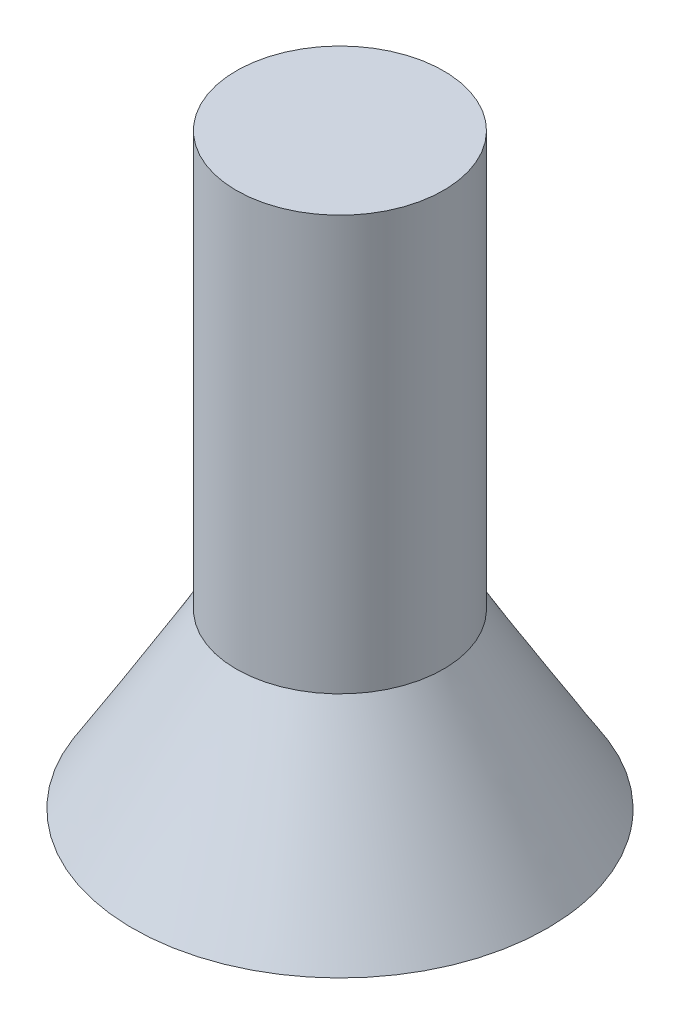
ISO-10303-21;
HEADER;
FILE_DESCRIPTION(('STEP AP214'),'2;1');
FILE_NAME('part.step','',(''),(''),'','','');
FILE_SCHEMA(('AUTOMOTIVE_DESIGN { 1 0 10303 214 1 1 1 1 }'));
ENDSEC;
DATA;
#1=APPLICATION_CONTEXT('core data for automotive mechanical design processes');
#2=APPLICATION_PROTOCOL_DEFINITION('international standard','automotive_design',2000,#1);
#3=PRODUCT_CONTEXT('',#1,'mechanical');
#4=PRODUCT('Part','Part','',(#3));
#5=PRODUCT_RELATED_PRODUCT_CATEGORY('part','',(#4));
#6=PRODUCT_DEFINITION_FORMATION('','',#4);
#7=PRODUCT_DEFINITION_CONTEXT('part definition',#1,'design');
#8=PRODUCT_DEFINITION('design','',#6,#7);
#9=PRODUCT_DEFINITION_SHAPE('','',#8);
#10=(LENGTH_UNIT() NAMED_UNIT(*) SI_UNIT(.MILLI.,.METRE.));
#11=(NAMED_UNIT(*) PLANE_ANGLE_UNIT() SI_UNIT($,.RADIAN.));
#12=(NAMED_UNIT(*) SI_UNIT($,.STERADIAN.) SOLID_ANGLE_UNIT());
#13=UNCERTAINTY_MEASURE_WITH_UNIT(LENGTH_MEASURE(1.E-05),#10,'distance_accuracy_value','');
#14=(GEOMETRIC_REPRESENTATION_CONTEXT(3) GLOBAL_UNCERTAINTY_ASSIGNED_CONTEXT((#13)) GLOBAL_UNIT_ASSIGNED_CONTEXT((#10,
#11,#12)) REPRESENTATION_CONTEXT('',''));
#15=CARTESIAN_POINT('',(0.,0.,0.));
#16=DIRECTION('',(0.,0.,1.));
#17=DIRECTION('',(1.,0.,0.));
#18=AXIS2_PLACEMENT_3D('',#15,#16,#17);
#19=CARTESIAN_POINT('',(0.,0.,0.));
#20=DIRECTION('',(0.,1.,0.));
#21=DIRECTION('',(0.,0.,1.));
#22=AXIS2_PLACEMENT_3D('',#19,#20,#21);
#23=PLANE('',#22);
#24=DIRECTION('',(-1.,0.,0.));
#25=VECTOR('',#24,1.);
#26=CARTESIAN_POINT('',(0.577350269189625,0.,1.));
#27=LINE('',#26,#25);
#28=CARTESIAN_POINT('',(0.577350269189625,0.,1.));
#29=VERTEX_POINT('',#28);
#30=CARTESIAN_POINT('',(-0.577350269189626,0.,1.));
#31=VERTEX_POINT('',#30);
#32=EDGE_CURVE('E138',#29,#31,#27,.T.);
#33=ORIENTED_EDGE('',*,*,#32,.F.);
#34=DIRECTION('',(-0.5,0.,0.866025403784439));
#35=VECTOR('',#34,1.);
#36=CARTESIAN_POINT('',(1.15470053837925,0.,0.));
#37=LINE('',#36,#35);
#38=CARTESIAN_POINT('',(1.15470053837925,0.,0.));
#39=VERTEX_POINT('',#38);
#40=EDGE_CURVE('E64',#39,#29,#37,.T.);
#41=ORIENTED_EDGE('',*,*,#40,.F.);
#42=DIRECTION('',(0.5,0.,0.866025403784439));
#43=VECTOR('',#42,1.);
#44=CARTESIAN_POINT('',(0.577350269189626,0.,-0.999999999999999));
#45=LINE('',#44,#43);
#46=CARTESIAN_POINT('',(0.577350269189626,0.,-0.999999999999999));
#47=VERTEX_POINT('',#46);
#48=EDGE_CURVE('E147',#47,#39,#45,.T.);
#49=ORIENTED_EDGE('',*,*,#48,.F.);
#50=DIRECTION('',(1.,0.,0.));
#51=VECTOR('',#50,1.);
#52=CARTESIAN_POINT('',(-0.577350269189625,0.,-0.999999999999999));
#53=LINE('',#52,#51);
#54=CARTESIAN_POINT('',(-0.577350269189625,0.,-0.999999999999999));
#55=VERTEX_POINT('',#54);
#56=EDGE_CURVE('E145',#55,#47,#53,.T.);
#57=ORIENTED_EDGE('',*,*,#56,.F.);
#58=DIRECTION('',(0.5,0.,-0.866025403784438));
#59=VECTOR('',#58,1.);
#60=CARTESIAN_POINT('',(-1.15470053837925,0.,0.));
#61=LINE('',#60,#59);
#62=CARTESIAN_POINT('',(-1.15470053837925,0.,0.));
#63=VERTEX_POINT('',#62);
#64=EDGE_CURVE('E112',#63,#55,#61,.T.);
#65=ORIENTED_EDGE('',*,*,#64,.F.);
#66=DIRECTION('',(-0.5,0.,-0.866025403784439));
#67=VECTOR('',#66,1.);
#68=CARTESIAN_POINT('',(-0.577350269189626,0.,1.));
#69=LINE('',#68,#67);
#70=EDGE_CURVE('E141',#31,#63,#69,.T.);
#71=ORIENTED_EDGE('',*,*,#70,.F.);
#72=EDGE_LOOP('',(#33,#41,#49,#57,#65,#71));
#73=FACE_BOUND('',#72,.T.);
#74=CARTESIAN_POINT('',(0.,0.,0.));
#75=DIRECTION('',(0.,1.,0.));
#76=DIRECTION('',(0.,0.,1.));
#77=AXIS2_PLACEMENT_3D('',#74,#75,#76);
#78=CIRCLE('',#77,3.);
#79=CARTESIAN_POINT('',(-2.6965657370898,0.,1.31473694157932));
#80=VERTEX_POINT('',#79);
#81=EDGE_CURVE('E57',#80,#80,#78,.T.);
#82=ORIENTED_EDGE('',*,*,#81,.F.);
#83=EDGE_LOOP('',(#82));
#84=FACE_BOUND('',#83,.T.);
#85=ADVANCED_FACE('F45',(#73,#84),#23,.F.);
#86=CARTESIAN_POINT('',(-2.6965657370898,0.,1.31473694157932));
#87=CARTESIAN_POINT('',(-1.46387514290812,2.5,0.327214862094814));
#88=CARTESIAN_POINT('',(-0.0670918539311506,0.,6.70786841575892));
#89=CARTESIAN_POINT('',(-0.809445418718492,2.5,3.25496514791106));
#90=CARTESIAN_POINT('',(5.32603962024845,0.,4.07839453260027));
#91=CARTESIAN_POINT('',(2.11830486709775,2.5,2.60053542372143));
#92=CARTESIAN_POINT('',(2.6965657370898,0.,-1.31473694157932));
#93=CARTESIAN_POINT('',(1.46387514290812,2.5,-0.327214862094814));
#94=CARTESIAN_POINT('',(0.0670918539311498,0.,-6.70786841575892));
#95=CARTESIAN_POINT('',(0.809445418718492,2.5,-3.25496514791106));
#96=CARTESIAN_POINT('',(-5.32603962024845,0.,-4.07839453260027));
#97=CARTESIAN_POINT('',(-2.11830486709775,2.5,-2.60053542372143));
#98=CARTESIAN_POINT('',(-2.6965657370898,0.,1.31473694157932));
#99=CARTESIAN_POINT('',(-1.46387514290812,2.5,0.327214862094814));
#100=(BOUNDED_SURFACE() B_SPLINE_SURFACE(3,1,((#86,#87),(#88,#89),(#90,#91),(#92,#93),(#94,#95),
(#96,#97),(#98,#99)),.UNSPECIFIED.,.T.,.F.,.F.) B_SPLINE_SURFACE_WITH_KNOTS((4,3,4),(2,2),(0.,
0.5,1.),(0.,1.),.UNSPECIFIED.) GEOMETRIC_REPRESENTATION_ITEM() RATIONAL_B_SPLINE_SURFACE(((1.,
1.),(0.333333333333333,0.333333333333333),(0.333333333333333,0.333333333333333),(1.,1.),
(0.333333333333333,0.333333333333333),(0.333333333333333,0.333333333333333),(1.,1.))) REPRESENTATION_ITEM('') SURFACE());
#101=CARTESIAN_POINT('',(0.,2.5,0.));
#102=DIRECTION('',(0.,1.,0.));
#103=DIRECTION('',(0.,0.,1.));
#104=AXIS2_PLACEMENT_3D('',#101,#102,#103);
#105=CIRCLE('',#104,1.5);
#106=CARTESIAN_POINT('',(-1.46387514290812,2.5,0.327214862094814));
#107=VERTEX_POINT('',#106);
#108=EDGE_CURVE('E12',#107,#107,#105,.T.);
#109=CARTESIAN_POINT('',(-2.6965657370898,0.,1.31473694157932));
#110=CARTESIAN_POINT('',(-2.68372521006707,0.0260416666666666,1.30445025325136));
#111=CARTESIAN_POINT('',(-2.67088468304435,0.0520833333333333,1.2941635649234));
#112=CARTESIAN_POINT('',(-2.6452036289989,0.104166666666667,1.27359018826747));
#113=CARTESIAN_POINT('',(-2.63236310197617,0.130208333333333,1.26330349993951));
#114=CARTESIAN_POINT('',(-2.60668204793072,0.182291666666667,1.24273012328358));
#115=CARTESIAN_POINT('',(-2.59384152090799,0.208333333333333,1.23244343495561));
#116=CARTESIAN_POINT('',(-2.56816046686254,0.260416666666667,1.21187005829969));
#117=CARTESIAN_POINT('',(-2.55531993983981,0.286458333333333,1.20158336997172));
#118=CARTESIAN_POINT('',(-2.52963888579436,0.338541666666667,1.1810099933158));
#119=CARTESIAN_POINT('',(-2.51679835877164,0.364583333333333,1.17072330498783));
#120=CARTESIAN_POINT('',(-2.49111730472619,0.416666666666667,1.15014992833191));
#121=CARTESIAN_POINT('',(-2.47827677770346,0.442708333333333,1.13986324000394));
#122=CARTESIAN_POINT('',(-2.45259572365801,0.494791666666667,1.11928986334801));
#123=CARTESIAN_POINT('',(-2.43975519663528,0.520833333333333,1.10900317502005));
#124=CARTESIAN_POINT('',(-2.41407414258983,0.572916666666667,1.08842979836412));
#125=CARTESIAN_POINT('',(-2.40123361556711,0.598958333333333,1.07814311003616));
#126=CARTESIAN_POINT('',(-2.37555256152165,0.651041666666667,1.05756973338023));
#127=CARTESIAN_POINT('',(-2.36271203449893,0.677083333333333,1.04728304505227));
#128=CARTESIAN_POINT('',(-2.33703098045348,0.729166666666667,1.02670966839634));
#129=CARTESIAN_POINT('',(-2.32419045343075,0.755208333333333,1.01642298006838));
#130=CARTESIAN_POINT('',(-2.2985093993853,0.807291666666667,0.995849603412451));
#131=CARTESIAN_POINT('',(-2.28566887236257,0.833333333333333,0.985562915084487));
#132=CARTESIAN_POINT('',(-2.25998781831712,0.885416666666667,0.96498953842856));
#133=CARTESIAN_POINT('',(-2.2471472912944,0.911458333333333,0.954702850100597));
#134=CARTESIAN_POINT('',(-2.22146623724894,0.963541666666667,0.934129473444669));
#135=CARTESIAN_POINT('',(-2.20862571022622,0.989583333333333,0.923842785116706));
#136=CARTESIAN_POINT('',(-2.18294465618077,1.04166666666667,0.903269408460778));
#137=CARTESIAN_POINT('',(-2.17010412915804,1.06770833333333,0.892982720132815));
#138=CARTESIAN_POINT('',(-2.14442307511259,1.11979166666667,0.872409343476888));
#139=CARTESIAN_POINT('',(-2.13158254808986,1.14583333333333,0.862122655148924));
#140=CARTESIAN_POINT('',(-2.10590149404441,1.19791666666667,0.841549278492997));
#141=CARTESIAN_POINT('',(-2.09306096702169,1.22395833333333,0.831262590165033));
#142=CARTESIAN_POINT('',(-2.06737991297623,1.27604166666667,0.810689213509106));
#143=CARTESIAN_POINT('',(-2.05453938595351,1.30208333333333,0.800402525181142));
#144=CARTESIAN_POINT('',(-2.02885833190806,1.35416666666667,0.779829148525215));
#145=CARTESIAN_POINT('',(-2.01601780488533,1.38020833333333,0.769542460197251));
#146=CARTESIAN_POINT('',(-1.99033675083988,1.43229166666667,0.748969083541324));
#147=CARTESIAN_POINT('',(-1.97749622381715,1.45833333333333,0.73868239521336));
#148=CARTESIAN_POINT('',(-1.9518151697717,1.51041666666667,0.718109018557433));
#149=CARTESIAN_POINT('',(-1.93897464274898,1.53645833333333,0.707822330229469));
#150=CARTESIAN_POINT('',(-1.91329358870352,1.58854166666667,0.687248953573542));
#151=CARTESIAN_POINT('',(-1.9004530616808,1.61458333333333,0.676962265245578));
#152=CARTESIAN_POINT('',(-1.87477200763535,1.66666666666667,0.656388888589651));
#153=CARTESIAN_POINT('',(-1.86193148061262,1.69270833333333,0.646102200261687));
#154=CARTESIAN_POINT('',(-1.83625042656717,1.74479166666667,0.62552882360576));
#155=CARTESIAN_POINT('',(-1.82340989954444,1.77083333333333,0.615242135277796));
#156=CARTESIAN_POINT('',(-1.79772884549899,1.82291666666667,0.594668758621869));
#157=CARTESIAN_POINT('',(-1.78488831847627,1.84895833333333,0.584382070293905));
#158=CARTESIAN_POINT('',(-1.75920726443081,1.90104166666667,0.563808693637978));
#159=CARTESIAN_POINT('',(-1.74636673740809,1.92708333333333,0.553522005310014));
#160=CARTESIAN_POINT('',(-1.72068568336264,1.97916666666667,0.532948628654087));
#161=CARTESIAN_POINT('',(-1.70784515633991,2.00520833333333,0.522661940326123));
#162=CARTESIAN_POINT('',(-1.68216410229446,2.05729166666667,0.502088563670196));
#163=CARTESIAN_POINT('',(-1.66932357527173,2.08333333333333,0.491801875342233));
#164=CARTESIAN_POINT('',(-1.64364252122628,2.13541666666667,0.471228498686305));
#165=CARTESIAN_POINT('',(-1.63080199420356,2.16145833333333,0.460941810358342));
#166=CARTESIAN_POINT('',(-1.6051209401581,2.21354166666667,0.440368433702414));
#167=CARTESIAN_POINT('',(-1.59228041313538,2.23958333333333,0.430081745374451));
#168=CARTESIAN_POINT('',(-1.56659935908993,2.29166666666667,0.409508368718523));
#169=CARTESIAN_POINT('',(-1.5537588320672,2.31770833333333,0.39922168039056));
#170=CARTESIAN_POINT('',(-1.52807777802175,2.36979166666667,0.378648303734633));
#171=CARTESIAN_POINT('',(-1.51523725099902,2.39583333333333,0.368361615406669));
#172=CARTESIAN_POINT('',(-1.48955619695357,2.44791666666667,0.347788238750742));
#173=CARTESIAN_POINT('',(-1.47671566993085,2.47395833333333,0.337501550422778));
#174=CARTESIAN_POINT('',(-1.46387514290812,2.5,0.327214862094814));
#175=B_SPLINE_CURVE_WITH_KNOTS('',3,(#109,#110,#111,#112,#113,#114,#115,#116,#117,#118,#119,
#120,#121,#122,#123,#124,#125,#126,#127,#128,#129,#130,#131,#132,#133,#134,#135,#136,#137,#138,
#139,#140,#141,#142,#143,#144,#145,#146,#147,#148,#149,#150,#151,#152,#153,#154,#155,#156,#157,
#158,#159,#160,#161,#162,#163,#164,#165,#166,#167,#168,#169,#170,#171,#172,#173,#174),
.UNSPECIFIED.,.F.,.F.,(4,2,2,2,2,2,2,2,2,2,2,2,2,2,2,2,2,2,2,2,2,2,2,2,2,2,2,2,2,2,2,2,4),(0.,
0.0924108837951578,0.184821767590315,0.277232651385473,0.369643535180631,0.462054418975788,
0.554465302770946,0.646876186566104,0.739287070361262,0.831697954156419,0.924108837951577,
1.01651972174673,1.10893060554189,1.20134148933705,1.29375237313221,1.38616325692737,
1.47857414072252,1.57098502451768,1.66339590831284,1.755806792108,1.84821767590315,
1.94062855969831,2.03303944349347,2.12545032728863,2.21786121108378,2.31027209487894,
2.4026829786741,2.49509386246926,2.58750474626442,2.67991563005957,2.77232651385473,
2.86473739764989,2.95714828144505),.UNSPECIFIED.);
#176=EDGE_CURVE('BSEAM47',#80,#107,#175,.T.);
#177=ORIENTED_EDGE('',*,*,#81,.T.);
#178=ORIENTED_EDGE('',*,*,#108,.F.);
#179=ORIENTED_EDGE('',*,*,#176,.T.);
#180=ORIENTED_EDGE('',*,*,#176,.F.);
#181=EDGE_LOOP('',(#177,#179,#178,#180));
#182=FACE_BOUND('',#181,.T.);
#183=ADVANCED_FACE('F47',(#182),#100,.T.);
#184=CARTESIAN_POINT('',(0.,8.5,0.));
#185=DIRECTION('',(0.,-1.,0.));
#186=DIRECTION('',(0.,0.,-1.));
#187=AXIS2_PLACEMENT_3D('',#184,#185,#186);
#188=CYLINDRICAL_SURFACE('',#187,1.5);
#189=CARTESIAN_POINT('',(0.,8.5,0.));
#190=DIRECTION('',(0.,1.,0.));
#191=DIRECTION('',(0.,0.,1.));
#192=AXIS2_PLACEMENT_3D('',#189,#190,#191);
#193=CIRCLE('',#192,1.5);
#194=CARTESIAN_POINT('',(0.,8.5,1.5));
#195=VERTEX_POINT('',#194);
#196=EDGE_CURVE('E151',#195,#195,#193,.T.);
#197=ORIENTED_EDGE('',*,*,#196,.F.);
#198=EDGE_LOOP('',(#197));
#199=FACE_BOUND('',#198,.T.);
#200=ORIENTED_EDGE('',*,*,#108,.T.);
#201=EDGE_LOOP('',(#200));
#202=FACE_BOUND('',#201,.T.);
#203=ADVANCED_FACE('F197',(#199,#202),#188,.T.);
#204=CARTESIAN_POINT('',(0.,8.5,0.));
#205=DIRECTION('',(0.,1.,0.));
#206=DIRECTION('',(0.,0.,1.));
#207=AXIS2_PLACEMENT_3D('',#204,#205,#206);
#208=PLANE('',#207);
#209=ORIENTED_EDGE('',*,*,#196,.T.);
#210=EDGE_LOOP('',(#209));
#211=FACE_BOUND('',#210,.T.);
#212=ADVANCED_FACE('F201',(#211),#208,.T.);
#213=CARTESIAN_POINT('',(1.15470053837925,0.5,0.));
#214=DIRECTION('',(0.866025403784439,0.,0.5));
#215=DIRECTION('',(0.5,0.,-0.866025403784439));
#216=AXIS2_PLACEMENT_3D('',#213,#214,#215);
#217=PLANE('',#216);
#218=ORIENTED_EDGE('',*,*,#40,.T.);
#219=DIRECTION('',(0.,-1.,0.));
#220=VECTOR('',#219,1.);
#221=CARTESIAN_POINT('',(0.577350269189625,0.5,1.));
#222=LINE('',#221,#220);
#223=CARTESIAN_POINT('',(0.577350269189625,0.5,1.));
#224=VERTEX_POINT('',#223);
#225=EDGE_CURVE('E94',#224,#29,#222,.T.);
#226=ORIENTED_EDGE('',*,*,#225,.F.);
#227=DIRECTION('',(-0.5,0.,0.866025403784439));
#228=VECTOR('',#227,1.);
#229=CARTESIAN_POINT('',(1.15470053837925,0.5,0.));
#230=LINE('',#229,#228);
#231=CARTESIAN_POINT('',(1.15470053837925,0.5,0.));
#232=VERTEX_POINT('',#231);
#233=EDGE_CURVE('E149',#232,#224,#230,.T.);
#234=ORIENTED_EDGE('',*,*,#233,.F.);
#235=DIRECTION('',(0.,-1.,0.));
#236=VECTOR('',#235,1.);
#237=CARTESIAN_POINT('',(1.15470053837925,0.5,0.));
#238=LINE('',#237,#236);
#239=EDGE_CURVE('E72',#232,#39,#238,.T.);
#240=ORIENTED_EDGE('',*,*,#239,.T.);
#241=EDGE_LOOP('',(#218,#226,#234,#240));
#242=FACE_BOUND('',#241,.T.);
#243=ADVANCED_FACE('F216',(#242),#217,.F.);
#244=CARTESIAN_POINT('',(0.577350269189626,0.5,-0.999999999999999));
#245=DIRECTION('',(0.866025403784438,0.,-0.5));
#246=DIRECTION('',(-0.5,0.,-0.866025403784439));
#247=AXIS2_PLACEMENT_3D('',#244,#245,#246);
#248=PLANE('',#247);
#249=ORIENTED_EDGE('',*,*,#48,.T.);
#250=ORIENTED_EDGE('',*,*,#239,.F.);
#251=DIRECTION('',(0.5,0.,0.866025403784439));
#252=VECTOR('',#251,1.);
#253=CARTESIAN_POINT('',(0.577350269189626,0.5,-0.999999999999999));
#254=LINE('',#253,#252);
#255=CARTESIAN_POINT('',(0.577350269189626,0.5,-0.999999999999999));
#256=VERTEX_POINT('',#255);
#257=EDGE_CURVE('E124',#256,#232,#254,.T.);
#258=ORIENTED_EDGE('',*,*,#257,.F.);
#259=DIRECTION('',(0.,-1.,0.));
#260=VECTOR('',#259,1.);
#261=CARTESIAN_POINT('',(0.577350269189626,0.5,-0.999999999999999));
#262=LINE('',#261,#260);
#263=EDGE_CURVE('E116',#256,#47,#262,.T.);
#264=ORIENTED_EDGE('',*,*,#263,.T.);
#265=EDGE_LOOP('',(#249,#250,#258,#264));
#266=FACE_BOUND('',#265,.T.);
#267=ADVANCED_FACE('F220',(#266),#248,.F.);
#268=CARTESIAN_POINT('',(-0.577350269189625,0.5,-0.999999999999999));
#269=DIRECTION('',(0.,0.,-1.));
#270=DIRECTION('',(-1.,0.,0.));
#271=AXIS2_PLACEMENT_3D('',#268,#269,#270);
#272=PLANE('',#271);
#273=ORIENTED_EDGE('',*,*,#56,.T.);
#274=ORIENTED_EDGE('',*,*,#263,.F.);
#275=DIRECTION('',(1.,0.,0.));
#276=VECTOR('',#275,1.);
#277=CARTESIAN_POINT('',(-0.577350269189625,0.5,-0.999999999999999));
#278=LINE('',#277,#276);
#279=CARTESIAN_POINT('',(-0.577350269189625,0.5,-0.999999999999999));
#280=VERTEX_POINT('',#279);
#281=EDGE_CURVE('E120',#280,#256,#278,.T.);
#282=ORIENTED_EDGE('',*,*,#281,.F.);
#283=DIRECTION('',(0.,-1.,0.));
#284=VECTOR('',#283,1.);
#285=CARTESIAN_POINT('',(-0.577350269189625,0.5,-0.999999999999999));
#286=LINE('',#285,#284);
#287=EDGE_CURVE('E105',#280,#55,#286,.T.);
#288=ORIENTED_EDGE('',*,*,#287,.T.);
#289=EDGE_LOOP('',(#273,#274,#282,#288));
#290=FACE_BOUND('',#289,.T.);
#291=ADVANCED_FACE('F121',(#290),#272,.F.);
#292=CARTESIAN_POINT('',(-1.15470053837925,0.5,0.));
#293=DIRECTION('',(-0.866025403784438,0.,-0.5));
#294=DIRECTION('',(-0.5,0.,0.866025403784439));
#295=AXIS2_PLACEMENT_3D('',#292,#293,#294);
#296=PLANE('',#295);
#297=ORIENTED_EDGE('',*,*,#64,.T.);
#298=ORIENTED_EDGE('',*,*,#287,.F.);
#299=DIRECTION('',(0.5,0.,-0.866025403784438));
#300=VECTOR('',#299,1.);
#301=CARTESIAN_POINT('',(-1.15470053837925,0.5,0.));
#302=LINE('',#301,#300);
#303=CARTESIAN_POINT('',(-1.15470053837925,0.5,0.));
#304=VERTEX_POINT('',#303);
#305=EDGE_CURVE('E109',#304,#280,#302,.T.);
#306=ORIENTED_EDGE('',*,*,#305,.F.);
#307=DIRECTION('',(0.,-1.,0.));
#308=VECTOR('',#307,1.);
#309=CARTESIAN_POINT('',(-1.15470053837925,0.5,0.));
#310=LINE('',#309,#308);
#311=EDGE_CURVE('E117',#304,#63,#310,.T.);
#312=ORIENTED_EDGE('',*,*,#311,.T.);
#313=EDGE_LOOP('',(#297,#298,#306,#312));
#314=FACE_BOUND('',#313,.T.);
#315=ADVANCED_FACE('F107',(#314),#296,.F.);
#316=CARTESIAN_POINT('',(-0.577350269189626,0.5,1.));
#317=DIRECTION('',(-0.866025403784439,0.,0.5));
#318=DIRECTION('',(0.5,0.,0.866025403784439));
#319=AXIS2_PLACEMENT_3D('',#316,#317,#318);
#320=PLANE('',#319);
#321=ORIENTED_EDGE('',*,*,#70,.T.);
#322=ORIENTED_EDGE('',*,*,#311,.F.);
#323=DIRECTION('',(-0.5,0.,-0.866025403784439));
#324=VECTOR('',#323,1.);
#325=CARTESIAN_POINT('',(-0.577350269189626,0.5,1.));
#326=LINE('',#325,#324);
#327=CARTESIAN_POINT('',(-0.577350269189626,0.5,1.));
#328=VERTEX_POINT('',#327);
#329=EDGE_CURVE('E130',#328,#304,#326,.T.);
#330=ORIENTED_EDGE('',*,*,#329,.F.);
#331=DIRECTION('',(0.,-1.,0.));
#332=VECTOR('',#331,1.);
#333=CARTESIAN_POINT('',(-0.577350269189626,0.5,1.));
#334=LINE('',#333,#332);
#335=EDGE_CURVE('E154',#328,#31,#334,.T.);
#336=ORIENTED_EDGE('',*,*,#335,.T.);
#337=EDGE_LOOP('',(#321,#322,#330,#336));
#338=FACE_BOUND('',#337,.T.);
#339=ADVANCED_FACE('F224',(#338),#320,.F.);
#340=CARTESIAN_POINT('',(0.577350269189625,0.5,1.));
#341=DIRECTION('',(0.,0.,1.));
#342=DIRECTION('',(1.,0.,0.));
#343=AXIS2_PLACEMENT_3D('',#340,#341,#342);
#344=PLANE('',#343);
#345=ORIENTED_EDGE('',*,*,#32,.T.);
#346=ORIENTED_EDGE('',*,*,#335,.F.);
#347=DIRECTION('',(-1.,0.,0.));
#348=VECTOR('',#347,1.);
#349=CARTESIAN_POINT('',(0.577350269189625,0.5,1.));
#350=LINE('',#349,#348);
#351=EDGE_CURVE('E132',#224,#328,#350,.T.);
#352=ORIENTED_EDGE('',*,*,#351,.F.);
#353=ORIENTED_EDGE('',*,*,#225,.T.);
#354=EDGE_LOOP('',(#345,#346,#352,#353));
#355=FACE_BOUND('',#354,.T.);
#356=ADVANCED_FACE('F221',(#355),#344,.F.);
#357=CARTESIAN_POINT('',(0.,0.5,0.));
#358=DIRECTION('',(0.,-1.,0.));
#359=DIRECTION('',(0.,0.,-1.));
#360=AXIS2_PLACEMENT_3D('',#357,#358,#359);
#361=PLANE('',#360);
#362=ORIENTED_EDGE('',*,*,#233,.T.);
#363=ORIENTED_EDGE('',*,*,#351,.T.);
#364=ORIENTED_EDGE('',*,*,#329,.T.);
#365=ORIENTED_EDGE('',*,*,#305,.T.);
#366=ORIENTED_EDGE('',*,*,#281,.T.);
#367=ORIENTED_EDGE('',*,*,#257,.T.);
#368=EDGE_LOOP('',(#362,#363,#364,#365,#366,#367));
#369=FACE_BOUND('',#368,.T.);
#370=ADVANCED_FACE('F127',(#369),#361,.T.);
#371=CLOSED_SHELL('',(#85,#183,#203,#212,#243,#267,#291,#315,#339,#356,#370));
#372=MANIFOLD_SOLID_BREP('B2',#371);
#373=ADVANCED_BREP_SHAPE_REPRESENTATION('',(#18,#372),#14);
#374=SHAPE_DEFINITION_REPRESENTATION(#9,#373);
ENDSEC;
END-ISO-10303-21;
